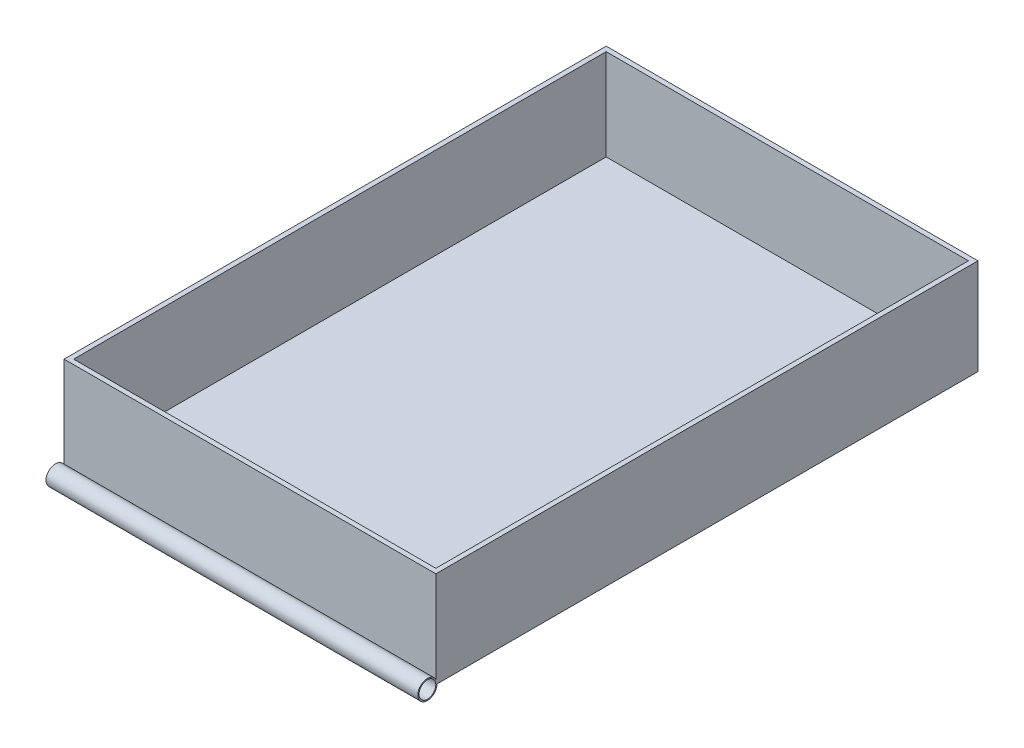
ISO-10303-21;
HEADER;
FILE_DESCRIPTION(('STEP AP214'),'2;1');
FILE_NAME('part.step','',(''),(''),'','','');
FILE_SCHEMA(('AUTOMOTIVE_DESIGN { 1 0 10303 214 1 1 1 1 }'));
ENDSEC;
DATA;
#1=APPLICATION_CONTEXT('core data for automotive mechanical design processes');
#2=APPLICATION_PROTOCOL_DEFINITION('international standard','automotive_design',2000,#1);
#3=PRODUCT_CONTEXT('',#1,'mechanical');
#4=PRODUCT('Part','Part','',(#3));
#5=PRODUCT_RELATED_PRODUCT_CATEGORY('part','',(#4));
#6=PRODUCT_DEFINITION_FORMATION('','',#4);
#7=PRODUCT_DEFINITION_CONTEXT('part definition',#1,'design');
#8=PRODUCT_DEFINITION('design','',#6,#7);
#9=PRODUCT_DEFINITION_SHAPE('','',#8);
#10=(LENGTH_UNIT() NAMED_UNIT(*) SI_UNIT(.MILLI.,.METRE.));
#11=(NAMED_UNIT(*) PLANE_ANGLE_UNIT() SI_UNIT($,.RADIAN.));
#12=(NAMED_UNIT(*) SI_UNIT($,.STERADIAN.) SOLID_ANGLE_UNIT());
#13=UNCERTAINTY_MEASURE_WITH_UNIT(LENGTH_MEASURE(1.E-05),#10,'distance_accuracy_value','');
#14=(GEOMETRIC_REPRESENTATION_CONTEXT(3) GLOBAL_UNCERTAINTY_ASSIGNED_CONTEXT((#13)) GLOBAL_UNIT_ASSIGNED_CONTEXT((#10,
#11,#12)) REPRESENTATION_CONTEXT('',''));
#15=CARTESIAN_POINT('',(0.,0.,0.));
#16=DIRECTION('',(0.,0.,1.));
#17=DIRECTION('',(1.,0.,0.));
#18=AXIS2_PLACEMENT_3D('',#15,#16,#17);
#19=CARTESIAN_POINT('',(387.5,200.,-565.));
#20=DIRECTION('',(-1.,0.,0.));
#21=DIRECTION('',(0.,0.,1.));
#22=AXIS2_PLACEMENT_3D('',#19,#20,#21);
#23=PLANE('',#22);
#24=CARTESIAN_POINT('',(387.5,0.,582.66692));
#25=DIRECTION('',(1.,0.,0.));
#26=DIRECTION('',(0.,0.,-1.));
#27=AXIS2_PLACEMENT_3D('',#24,#25,#26);
#28=CIRCLE('',#27,17.4999999999999);
#29=CARTESIAN_POINT('',(387.5,0.,565.16692));
#30=VERTEX_POINT('',#29);
#31=EDGE_CURVE('E182',#30,#30,#28,.T.);
#32=ORIENTED_EDGE('',*,*,#31,.F.);
#33=EDGE_LOOP('',(#32));
#34=FACE_BOUND('',#33,.T.);
#35=DIRECTION('',(0.,-1.,0.));
#36=VECTOR('',#35,1.);
#37=CARTESIAN_POINT('',(387.5,200.,565.));
#38=LINE('',#37,#36);
#39=CARTESIAN_POINT('',(387.5,200.,565.));
#40=VERTEX_POINT('',#39);
#41=CARTESIAN_POINT('',(387.5,9.37442999406348,565.));
#42=VERTEX_POINT('',#41);
#43=EDGE_CURVE('E117',#40,#42,#38,.T.);
#44=ORIENTED_EDGE('',*,*,#43,.T.);
#45=CARTESIAN_POINT('',(387.5,0.,582.66692));
#46=DIRECTION('',(1.,0.,0.));
#47=DIRECTION('',(0.,0.,-1.));
#48=AXIS2_PLACEMENT_3D('',#45,#46,#47);
#49=CIRCLE('',#48,20.);
#50=CARTESIAN_POINT('',(387.5,0.,562.66692));
#51=VERTEX_POINT('',#50);
#52=EDGE_CURVE('E50',#42,#51,#49,.T.);
#53=ORIENTED_EDGE('',*,*,#52,.T.);
#54=DIRECTION('',(0.,0.,-1.));
#55=VECTOR('',#54,1.);
#56=CARTESIAN_POINT('',(387.5,0.,-565.));
#57=LINE('',#56,#55);
#58=CARTESIAN_POINT('',(387.5,0.,-565.));
#59=VERTEX_POINT('',#58);
#60=EDGE_CURVE('E145',#51,#59,#57,.T.);
#61=ORIENTED_EDGE('',*,*,#60,.T.);
#62=DIRECTION('',(0.,-1.,0.));
#63=VECTOR('',#62,1.);
#64=CARTESIAN_POINT('',(387.5,200.,-565.));
#65=LINE('',#64,#63);
#66=CARTESIAN_POINT('',(387.5,200.,-565.));
#67=VERTEX_POINT('',#66);
#68=EDGE_CURVE('E43',#67,#59,#65,.T.);
#69=ORIENTED_EDGE('',*,*,#68,.F.);
#70=DIRECTION('',(0.,0.,-1.));
#71=VECTOR('',#70,1.);
#72=CARTESIAN_POINT('',(387.5,200.,-565.));
#73=LINE('',#72,#71);
#74=EDGE_CURVE('E125',#40,#67,#73,.T.);
#75=ORIENTED_EDGE('',*,*,#74,.F.);
#76=EDGE_LOOP('',(#44,#53,#61,#69,#75));
#77=FACE_BOUND('',#76,.T.);
#78=ADVANCED_FACE('F35',(#34,#77),#23,.F.);
#79=CARTESIAN_POINT('',(-387.5,200.,-565.));
#80=DIRECTION('',(0.,0.,1.));
#81=DIRECTION('',(1.,0.,0.));
#82=AXIS2_PLACEMENT_3D('',#79,#80,#81);
#83=PLANE('',#82);
#84=DIRECTION('',(-1.,0.,0.));
#85=VECTOR('',#84,1.);
#86=CARTESIAN_POINT('',(-387.5,0.,-565.));
#87=LINE('',#86,#85);
#88=CARTESIAN_POINT('',(-387.5,0.,-565.));
#89=VERTEX_POINT('',#88);
#90=EDGE_CURVE('E143',#59,#89,#87,.T.);
#91=ORIENTED_EDGE('',*,*,#90,.T.);
#92=DIRECTION('',(0.,-1.,0.));
#93=VECTOR('',#92,1.);
#94=CARTESIAN_POINT('',(-387.5,200.,-565.));
#95=LINE('',#94,#93);
#96=CARTESIAN_POINT('',(-387.5,200.,-565.));
#97=VERTEX_POINT('',#96);
#98=EDGE_CURVE('E128',#97,#89,#95,.T.);
#99=ORIENTED_EDGE('',*,*,#98,.F.);
#100=DIRECTION('',(-1.,0.,0.));
#101=VECTOR('',#100,1.);
#102=CARTESIAN_POINT('',(-387.5,200.,-565.));
#103=LINE('',#102,#101);
#104=EDGE_CURVE('E144',#67,#97,#103,.T.);
#105=ORIENTED_EDGE('',*,*,#104,.F.);
#106=ORIENTED_EDGE('',*,*,#68,.T.);
#107=EDGE_LOOP('',(#91,#99,#105,#106));
#108=FACE_BOUND('',#107,.T.);
#109=ADVANCED_FACE('F140',(#108),#83,.F.);
#110=CARTESIAN_POINT('',(-387.5,200.,-565.));
#111=DIRECTION('',(1.,0.,0.));
#112=DIRECTION('',(0.,0.,-1.));
#113=AXIS2_PLACEMENT_3D('',#110,#111,#112);
#114=PLANE('',#113);
#115=CARTESIAN_POINT('',(-387.5,0.,582.66692));
#116=DIRECTION('',(1.,0.,0.));
#117=DIRECTION('',(0.,0.,-1.));
#118=AXIS2_PLACEMENT_3D('',#115,#116,#117);
#119=CIRCLE('',#118,17.4999999999999);
#120=CARTESIAN_POINT('',(-387.5,0.,565.16692));
#121=VERTEX_POINT('',#120);
#122=EDGE_CURVE('E38',#121,#121,#119,.T.);
#123=ORIENTED_EDGE('',*,*,#122,.T.);
#124=EDGE_LOOP('',(#123));
#125=FACE_BOUND('',#124,.T.);
#126=DIRECTION('',(0.,0.,1.));
#127=VECTOR('',#126,1.);
#128=CARTESIAN_POINT('',(-387.5,0.,-565.));
#129=LINE('',#128,#127);
#130=CARTESIAN_POINT('',(-387.5,0.,562.66692));
#131=VERTEX_POINT('',#130);
#132=EDGE_CURVE('E133',#89,#131,#129,.T.);
#133=ORIENTED_EDGE('',*,*,#132,.T.);
#134=CARTESIAN_POINT('',(-387.5,0.,582.66692));
#135=DIRECTION('',(1.,0.,0.));
#136=DIRECTION('',(0.,0.,-1.));
#137=AXIS2_PLACEMENT_3D('',#134,#135,#136);
#138=CIRCLE('',#137,20.);
#139=CARTESIAN_POINT('',(-387.5,9.37442999406327,565.));
#140=VERTEX_POINT('',#139);
#141=EDGE_CURVE('E110',#140,#131,#138,.T.);
#142=ORIENTED_EDGE('',*,*,#141,.F.);
#143=DIRECTION('',(0.,-1.,0.));
#144=VECTOR('',#143,1.);
#145=CARTESIAN_POINT('',(-387.5,200.,565.));
#146=LINE('',#145,#144);
#147=CARTESIAN_POINT('',(-387.5,200.,565.));
#148=VERTEX_POINT('',#147);
#149=EDGE_CURVE('E120',#148,#140,#146,.T.);
#150=ORIENTED_EDGE('',*,*,#149,.F.);
#151=DIRECTION('',(0.,0.,1.));
#152=VECTOR('',#151,1.);
#153=CARTESIAN_POINT('',(-387.5,200.,-565.));
#154=LINE('',#153,#152);
#155=EDGE_CURVE('E130',#97,#148,#154,.T.);
#156=ORIENTED_EDGE('',*,*,#155,.F.);
#157=ORIENTED_EDGE('',*,*,#98,.T.);
#158=EDGE_LOOP('',(#133,#142,#150,#156,#157));
#159=FACE_BOUND('',#158,.T.);
#160=ADVANCED_FACE('F189',(#125,#159),#114,.F.);
#161=CARTESIAN_POINT('',(-387.5,200.,565.));
#162=DIRECTION('',(0.,0.,-1.));
#163=DIRECTION('',(-1.,0.,0.));
#164=AXIS2_PLACEMENT_3D('',#161,#162,#163);
#165=PLANE('',#164);
#166=ORIENTED_EDGE('',*,*,#149,.T.);
#167=DIRECTION('',(1.,0.,0.));
#168=VECTOR('',#167,1.);
#169=CARTESIAN_POINT('',(-387.5,9.37442999406327,565.));
#170=LINE('',#169,#168);
#171=EDGE_CURVE('E107',#140,#42,#170,.T.);
#172=ORIENTED_EDGE('',*,*,#171,.T.);
#173=ORIENTED_EDGE('',*,*,#43,.F.);
#174=DIRECTION('',(1.,0.,0.));
#175=VECTOR('',#174,1.);
#176=CARTESIAN_POINT('',(-387.5,200.,565.));
#177=LINE('',#176,#175);
#178=EDGE_CURVE('E126',#148,#40,#177,.T.);
#179=ORIENTED_EDGE('',*,*,#178,.F.);
#180=EDGE_LOOP('',(#166,#172,#173,#179));
#181=FACE_BOUND('',#180,.T.);
#182=ADVANCED_FACE('F115',(#181),#165,.F.);
#183=CARTESIAN_POINT('',(0.,200.,0.));
#184=DIRECTION('',(0.,1.,0.));
#185=DIRECTION('',(0.,0.,1.));
#186=AXIS2_PLACEMENT_3D('',#183,#184,#185);
#187=PLANE('',#186);
#188=DIRECTION('',(0.,0.,-1.));
#189=VECTOR('',#188,1.);
#190=CARTESIAN_POINT('',(377.5,200.,-565.));
#191=LINE('',#190,#189);
#192=CARTESIAN_POINT('',(377.5,200.,555.));
#193=VERTEX_POINT('',#192);
#194=CARTESIAN_POINT('',(377.5,200.,-555.));
#195=VERTEX_POINT('',#194);
#196=EDGE_CURVE('E163',#193,#195,#191,.T.);
#197=ORIENTED_EDGE('',*,*,#196,.F.);
#198=DIRECTION('',(1.,0.,0.));
#199=VECTOR('',#198,1.);
#200=CARTESIAN_POINT('',(-387.5,200.,555.));
#201=LINE('',#200,#199);
#202=CARTESIAN_POINT('',(-377.5,200.,555.));
#203=VERTEX_POINT('',#202);
#204=EDGE_CURVE('E156',#203,#193,#201,.T.);
#205=ORIENTED_EDGE('',*,*,#204,.F.);
#206=DIRECTION('',(0.,0.,1.));
#207=VECTOR('',#206,1.);
#208=CARTESIAN_POINT('',(-377.5,200.,-565.));
#209=LINE('',#208,#207);
#210=CARTESIAN_POINT('',(-377.5,200.,-555.));
#211=VERTEX_POINT('',#210);
#212=EDGE_CURVE('E159',#211,#203,#209,.T.);
#213=ORIENTED_EDGE('',*,*,#212,.F.);
#214=DIRECTION('',(-1.,0.,0.));
#215=VECTOR('',#214,1.);
#216=CARTESIAN_POINT('',(-387.5,200.,-555.));
#217=LINE('',#216,#215);
#218=EDGE_CURVE('E161',#195,#211,#217,.T.);
#219=ORIENTED_EDGE('',*,*,#218,.F.);
#220=EDGE_LOOP('',(#197,#205,#213,#219));
#221=FACE_BOUND('',#220,.T.);
#222=ORIENTED_EDGE('',*,*,#74,.T.);
#223=ORIENTED_EDGE('',*,*,#104,.T.);
#224=ORIENTED_EDGE('',*,*,#155,.T.);
#225=ORIENTED_EDGE('',*,*,#178,.T.);
#226=EDGE_LOOP('',(#222,#223,#224,#225));
#227=FACE_BOUND('',#226,.T.);
#228=ADVANCED_FACE('F212',(#221,#227),#187,.T.);
#229=CARTESIAN_POINT('',(0.,0.,0.));
#230=DIRECTION('',(0.,1.,0.));
#231=DIRECTION('',(0.,0.,1.));
#232=AXIS2_PLACEMENT_3D('',#229,#230,#231);
#233=PLANE('',#232);
#234=ORIENTED_EDGE('',*,*,#60,.F.);
#235=DIRECTION('',(1.,0.,0.));
#236=VECTOR('',#235,1.);
#237=CARTESIAN_POINT('',(-387.5,0.,562.66692));
#238=LINE('',#237,#236);
#239=EDGE_CURVE('E11',#51,#131,#238,.F.);
#240=ORIENTED_EDGE('',*,*,#239,.T.);
#241=ORIENTED_EDGE('',*,*,#132,.F.);
#242=ORIENTED_EDGE('',*,*,#90,.F.);
#243=EDGE_LOOP('',(#234,#240,#241,#242));
#244=FACE_BOUND('',#243,.T.);
#245=ADVANCED_FACE('F150',(#244),#233,.F.);
#246=CARTESIAN_POINT('',(377.5,200.,-565.));
#247=DIRECTION('',(-1.,0.,0.));
#248=DIRECTION('',(0.,0.,1.));
#249=AXIS2_PLACEMENT_3D('',#246,#247,#248);
#250=PLANE('',#249);
#251=DIRECTION('',(0.,0.,-1.));
#252=VECTOR('',#251,1.);
#253=CARTESIAN_POINT('',(377.5,10.,-565.));
#254=LINE('',#253,#252);
#255=CARTESIAN_POINT('',(377.5,10.,555.));
#256=VERTEX_POINT('',#255);
#257=CARTESIAN_POINT('',(377.5,10.,-555.));
#258=VERTEX_POINT('',#257);
#259=EDGE_CURVE('E121',#256,#258,#254,.T.);
#260=ORIENTED_EDGE('',*,*,#259,.F.);
#261=DIRECTION('',(0.,-1.,0.));
#262=VECTOR('',#261,1.);
#263=CARTESIAN_POINT('',(377.5,200.,555.));
#264=LINE('',#263,#262);
#265=EDGE_CURVE('E158',#193,#256,#264,.T.);
#266=ORIENTED_EDGE('',*,*,#265,.F.);
#267=ORIENTED_EDGE('',*,*,#196,.T.);
#268=DIRECTION('',(0.,-1.,0.));
#269=VECTOR('',#268,1.);
#270=CARTESIAN_POINT('',(377.5,200.,-555.));
#271=LINE('',#270,#269);
#272=EDGE_CURVE('E147',#195,#258,#271,.T.);
#273=ORIENTED_EDGE('',*,*,#272,.T.);
#274=EDGE_LOOP('',(#260,#266,#267,#273));
#275=FACE_BOUND('',#274,.T.);
#276=ADVANCED_FACE('F215',(#275),#250,.T.);
#277=CARTESIAN_POINT('',(-387.5,200.,-555.));
#278=DIRECTION('',(0.,0.,1.));
#279=DIRECTION('',(1.,0.,0.));
#280=AXIS2_PLACEMENT_3D('',#277,#278,#279);
#281=PLANE('',#280);
#282=DIRECTION('',(-1.,0.,0.));
#283=VECTOR('',#282,1.);
#284=CARTESIAN_POINT('',(-387.5,10.,-555.));
#285=LINE('',#284,#283);
#286=CARTESIAN_POINT('',(-377.5,10.,-555.));
#287=VERTEX_POINT('',#286);
#288=EDGE_CURVE('E171',#258,#287,#285,.T.);
#289=ORIENTED_EDGE('',*,*,#288,.F.);
#290=ORIENTED_EDGE('',*,*,#272,.F.);
#291=ORIENTED_EDGE('',*,*,#218,.T.);
#292=DIRECTION('',(0.,-1.,0.));
#293=VECTOR('',#292,1.);
#294=CARTESIAN_POINT('',(-377.5,200.,-555.));
#295=LINE('',#294,#293);
#296=EDGE_CURVE('E169',#211,#287,#295,.T.);
#297=ORIENTED_EDGE('',*,*,#296,.T.);
#298=EDGE_LOOP('',(#289,#290,#291,#297));
#299=FACE_BOUND('',#298,.T.);
#300=ADVANCED_FACE('F228',(#299),#281,.T.);
#301=CARTESIAN_POINT('',(-377.5,200.,-565.));
#302=DIRECTION('',(1.,0.,0.));
#303=DIRECTION('',(0.,0.,-1.));
#304=AXIS2_PLACEMENT_3D('',#301,#302,#303);
#305=PLANE('',#304);
#306=DIRECTION('',(0.,0.,1.));
#307=VECTOR('',#306,1.);
#308=CARTESIAN_POINT('',(-377.5,10.,-565.));
#309=LINE('',#308,#307);
#310=CARTESIAN_POINT('',(-377.5,10.,555.));
#311=VERTEX_POINT('',#310);
#312=EDGE_CURVE('E167',#287,#311,#309,.T.);
#313=ORIENTED_EDGE('',*,*,#312,.F.);
#314=ORIENTED_EDGE('',*,*,#296,.F.);
#315=ORIENTED_EDGE('',*,*,#212,.T.);
#316=DIRECTION('',(0.,-1.,0.));
#317=VECTOR('',#316,1.);
#318=CARTESIAN_POINT('',(-377.5,200.,555.));
#319=LINE('',#318,#317);
#320=EDGE_CURVE('E58',#203,#311,#319,.T.);
#321=ORIENTED_EDGE('',*,*,#320,.T.);
#322=EDGE_LOOP('',(#313,#314,#315,#321));
#323=FACE_BOUND('',#322,.T.);
#324=ADVANCED_FACE('F225',(#323),#305,.T.);
#325=CARTESIAN_POINT('',(-387.5,200.,555.));
#326=DIRECTION('',(0.,0.,-1.));
#327=DIRECTION('',(-1.,0.,0.));
#328=AXIS2_PLACEMENT_3D('',#325,#326,#327);
#329=PLANE('',#328);
#330=DIRECTION('',(1.,0.,0.));
#331=VECTOR('',#330,1.);
#332=CARTESIAN_POINT('',(-387.5,10.,555.));
#333=LINE('',#332,#331);
#334=EDGE_CURVE('E165',#311,#256,#333,.T.);
#335=ORIENTED_EDGE('',*,*,#334,.F.);
#336=ORIENTED_EDGE('',*,*,#320,.F.);
#337=ORIENTED_EDGE('',*,*,#204,.T.);
#338=ORIENTED_EDGE('',*,*,#265,.T.);
#339=EDGE_LOOP('',(#335,#336,#337,#338));
#340=FACE_BOUND('',#339,.T.);
#341=ADVANCED_FACE('F221',(#340),#329,.T.);
#342=CARTESIAN_POINT('',(0.,10.,0.));
#343=DIRECTION('',(0.,1.,0.));
#344=DIRECTION('',(0.,0.,1.));
#345=AXIS2_PLACEMENT_3D('',#342,#343,#344);
#346=PLANE('',#345);
#347=ORIENTED_EDGE('',*,*,#259,.T.);
#348=ORIENTED_EDGE('',*,*,#288,.T.);
#349=ORIENTED_EDGE('',*,*,#312,.T.);
#350=ORIENTED_EDGE('',*,*,#334,.T.);
#351=EDGE_LOOP('',(#347,#348,#349,#350));
#352=FACE_BOUND('',#351,.T.);
#353=ADVANCED_FACE('F198',(#352),#346,.T.);
#354=CARTESIAN_POINT('',(-387.5,0.,582.66692));
#355=DIRECTION('',(1.,0.,0.));
#356=DIRECTION('',(0.,0.,-1.));
#357=AXIS2_PLACEMENT_3D('',#354,#355,#356);
#358=CYLINDRICAL_SURFACE('',#357,20.);
#359=ORIENTED_EDGE('',*,*,#171,.F.);
#360=ORIENTED_EDGE('',*,*,#141,.T.);
#361=ORIENTED_EDGE('',*,*,#239,.F.);
#362=ORIENTED_EDGE('',*,*,#52,.F.);
#363=EDGE_LOOP('',(#359,#360,#361,#362));
#364=FACE_BOUND('',#363,.T.);
#365=ADVANCED_FACE('F106',(#364),#358,.T.);
#366=CARTESIAN_POINT('',(-892.5,0.,582.66692));
#367=DIRECTION('',(1.,0.,0.));
#368=DIRECTION('',(0.,0.,-1.));
#369=AXIS2_PLACEMENT_3D('',#366,#367,#368);
#370=CYLINDRICAL_SURFACE('',#369,17.4999999999999);
#371=ORIENTED_EDGE('',*,*,#31,.T.);
#372=EDGE_LOOP('',(#371));
#373=FACE_BOUND('',#372,.T.);
#374=ORIENTED_EDGE('',*,*,#122,.F.);
#375=EDGE_LOOP('',(#374));
#376=FACE_BOUND('',#375,.T.);
#377=ADVANCED_FACE('F192',(#373,#376),#370,.F.);
#378=CLOSED_SHELL('',(#78,#109,#160,#182,#228,#245,#276,#300,#324,#341,#353,#365,#377));
#379=MANIFOLD_SOLID_BREP('B2',#378);
#380=ADVANCED_BREP_SHAPE_REPRESENTATION('',(#18,#379),#14);
#381=SHAPE_DEFINITION_REPRESENTATION(#9,#380);
ENDSEC;
END-ISO-10303-21;
